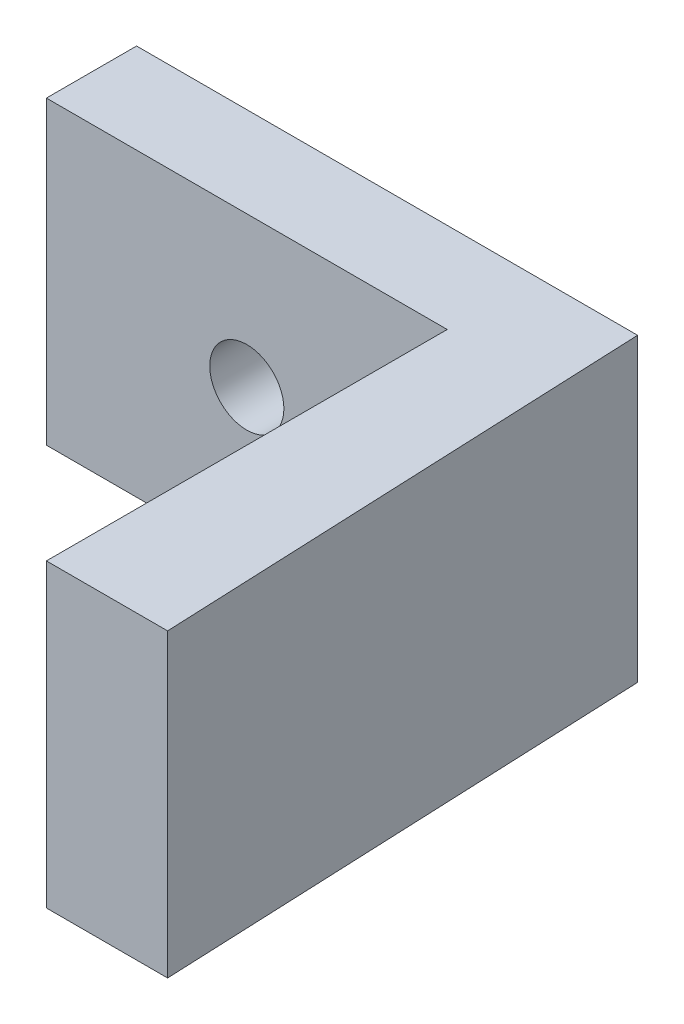
ISO-10303-21;
HEADER;
FILE_DESCRIPTION(('STEP AP214'),'2;1');
FILE_NAME('part.step','',(''),(''),'','','');
FILE_SCHEMA(('AUTOMOTIVE_DESIGN { 1 0 10303 214 1 1 1 1 }'));
ENDSEC;
DATA;
#1=APPLICATION_CONTEXT('core data for automotive mechanical design processes');
#2=APPLICATION_PROTOCOL_DEFINITION('international standard','automotive_design',2000,#1);
#3=PRODUCT_CONTEXT('',#1,'mechanical');
#4=PRODUCT('Part','Part','',(#3));
#5=PRODUCT_RELATED_PRODUCT_CATEGORY('part','',(#4));
#6=PRODUCT_DEFINITION_FORMATION('','',#4);
#7=PRODUCT_DEFINITION_CONTEXT('part definition',#1,'design');
#8=PRODUCT_DEFINITION('design','',#6,#7);
#9=PRODUCT_DEFINITION_SHAPE('','',#8);
#10=(LENGTH_UNIT() NAMED_UNIT(*) SI_UNIT(.MILLI.,.METRE.));
#11=(NAMED_UNIT(*) PLANE_ANGLE_UNIT() SI_UNIT($,.RADIAN.));
#12=(NAMED_UNIT(*) SI_UNIT($,.STERADIAN.) SOLID_ANGLE_UNIT());
#13=UNCERTAINTY_MEASURE_WITH_UNIT(LENGTH_MEASURE(1.E-05),#10,'distance_accuracy_value','');
#14=(GEOMETRIC_REPRESENTATION_CONTEXT(3) GLOBAL_UNCERTAINTY_ASSIGNED_CONTEXT((#13)) GLOBAL_UNIT_ASSIGNED_CONTEXT((#10,
#11,#12)) REPRESENTATION_CONTEXT('',''));
#15=CARTESIAN_POINT('',(0.,0.,0.));
#16=DIRECTION('',(0.,0.,1.));
#17=DIRECTION('',(1.,0.,0.));
#18=AXIS2_PLACEMENT_3D('',#15,#16,#17);
#19=CARTESIAN_POINT('',(0.,15.,0.));
#20=DIRECTION('',(1.,0.,0.));
#21=DIRECTION('',(0.,0.,-1.));
#22=AXIS2_PLACEMENT_3D('',#19,#20,#21);
#23=PLANE('',#22);
#24=DIRECTION('',(0.,0.,1.));
#25=VECTOR('',#24,1.);
#26=CARTESIAN_POINT('',(0.,0.,0.));
#27=LINE('',#26,#25);
#28=CARTESIAN_POINT('',(0.,0.,-4.5));
#29=VERTEX_POINT('',#28);
#30=CARTESIAN_POINT('',(0.,0.,0.));
#31=VERTEX_POINT('',#30);
#32=EDGE_CURVE('E130',#29,#31,#27,.T.);
#33=ORIENTED_EDGE('',*,*,#32,.T.);
#34=DIRECTION('',(0.,-1.,0.));
#35=VECTOR('',#34,1.);
#36=CARTESIAN_POINT('',(0.,15.,0.));
#37=LINE('',#36,#35);
#38=CARTESIAN_POINT('',(0.,15.,0.));
#39=VERTEX_POINT('',#38);
#40=EDGE_CURVE('E11',#39,#31,#37,.T.);
#41=ORIENTED_EDGE('',*,*,#40,.F.);
#42=DIRECTION('',(0.,0.,1.));
#43=VECTOR('',#42,1.);
#44=CARTESIAN_POINT('',(0.,15.,0.));
#45=LINE('',#44,#43);
#46=CARTESIAN_POINT('',(0.,15.,-4.5));
#47=VERTEX_POINT('',#46);
#48=EDGE_CURVE('E146',#47,#39,#45,.T.);
#49=ORIENTED_EDGE('',*,*,#48,.F.);
#50=DIRECTION('',(0.,-1.,0.));
#51=VECTOR('',#50,1.);
#52=CARTESIAN_POINT('',(0.,15.,-4.5));
#53=LINE('',#52,#51);
#54=EDGE_CURVE('E126',#47,#29,#53,.T.);
#55=ORIENTED_EDGE('',*,*,#54,.T.);
#56=EDGE_LOOP('',(#33,#41,#49,#55));
#57=FACE_BOUND('',#56,.T.);
#58=ADVANCED_FACE('F38',(#57),#23,.F.);
#59=CARTESIAN_POINT('',(0.,15.,0.));
#60=DIRECTION('',(0.,0.,-1.));
#61=DIRECTION('',(-1.,0.,0.));
#62=AXIS2_PLACEMENT_3D('',#59,#60,#61);
#63=PLANE('',#62);
#64=CARTESIAN_POINT('',(10.,7.5,0.));
#65=DIRECTION('',(0.,0.,1.));
#66=DIRECTION('',(1.,0.,0.));
#67=AXIS2_PLACEMENT_3D('',#64,#65,#66);
#68=CIRCLE('',#67,1.85);
#69=CARTESIAN_POINT('',(11.85,7.5,0.));
#70=VERTEX_POINT('',#69);
#71=EDGE_CURVE('E167',#70,#70,#68,.T.);
#72=ORIENTED_EDGE('',*,*,#71,.F.);
#73=EDGE_LOOP('',(#72));
#74=FACE_BOUND('',#73,.T.);
#75=DIRECTION('',(1.,0.,0.));
#76=VECTOR('',#75,1.);
#77=CARTESIAN_POINT('',(0.,0.,0.));
#78=LINE('',#77,#76);
#79=CARTESIAN_POINT('',(20.,0.,0.));
#80=VERTEX_POINT('',#79);
#81=EDGE_CURVE('E133',#31,#80,#78,.T.);
#82=ORIENTED_EDGE('',*,*,#81,.T.);
#83=DIRECTION('',(0.,-1.,0.));
#84=VECTOR('',#83,1.);
#85=CARTESIAN_POINT('',(20.,15.,0.));
#86=LINE('',#85,#84);
#87=CARTESIAN_POINT('',(20.,15.,0.));
#88=VERTEX_POINT('',#87);
#89=EDGE_CURVE('E47',#88,#80,#86,.T.);
#90=ORIENTED_EDGE('',*,*,#89,.F.);
#91=DIRECTION('',(1.,0.,0.));
#92=VECTOR('',#91,1.);
#93=CARTESIAN_POINT('',(0.,15.,0.));
#94=LINE('',#93,#92);
#95=EDGE_CURVE('E94',#39,#88,#94,.T.);
#96=ORIENTED_EDGE('',*,*,#95,.F.);
#97=ORIENTED_EDGE('',*,*,#40,.T.);
#98=EDGE_LOOP('',(#82,#90,#96,#97));
#99=FACE_BOUND('',#98,.T.);
#100=ADVANCED_FACE('F187',(#74,#99),#63,.F.);
#101=CARTESIAN_POINT('',(20.,15.,20.));
#102=DIRECTION('',(1.,0.,0.));
#103=DIRECTION('',(0.,0.,-1.));
#104=AXIS2_PLACEMENT_3D('',#101,#102,#103);
#105=PLANE('',#104);
#106=DIRECTION('',(0.,0.,1.));
#107=VECTOR('',#106,1.);
#108=CARTESIAN_POINT('',(20.,0.,20.));
#109=LINE('',#108,#107);
#110=CARTESIAN_POINT('',(20.,0.,20.));
#111=VERTEX_POINT('',#110);
#112=EDGE_CURVE('E137',#80,#111,#109,.T.);
#113=ORIENTED_EDGE('',*,*,#112,.T.);
#114=DIRECTION('',(0.,-1.,0.));
#115=VECTOR('',#114,1.);
#116=CARTESIAN_POINT('',(20.,15.,20.));
#117=LINE('',#116,#115);
#118=CARTESIAN_POINT('',(20.,15.,20.));
#119=VERTEX_POINT('',#118);
#120=EDGE_CURVE('E120',#119,#111,#117,.T.);
#121=ORIENTED_EDGE('',*,*,#120,.F.);
#122=DIRECTION('',(0.,0.,1.));
#123=VECTOR('',#122,1.);
#124=CARTESIAN_POINT('',(20.,15.,20.));
#125=LINE('',#124,#123);
#126=EDGE_CURVE('E109',#88,#119,#125,.T.);
#127=ORIENTED_EDGE('',*,*,#126,.F.);
#128=ORIENTED_EDGE('',*,*,#89,.T.);
#129=EDGE_LOOP('',(#113,#121,#127,#128));
#130=FACE_BOUND('',#129,.T.);
#131=ADVANCED_FACE('F156',(#130),#105,.F.);
#132=CARTESIAN_POINT('',(26.0482728718616,15.,20.));
#133=DIRECTION('',(0.,0.,-1.));
#134=DIRECTION('',(-1.,0.,0.));
#135=AXIS2_PLACEMENT_3D('',#132,#133,#134);
#136=PLANE('',#135);
#137=DIRECTION('',(1.,0.,0.));
#138=VECTOR('',#137,1.);
#139=CARTESIAN_POINT('',(26.0482728718616,0.,20.));
#140=LINE('',#139,#138);
#141=CARTESIAN_POINT('',(26.0482728718616,0.,20.));
#142=VERTEX_POINT('',#141);
#143=EDGE_CURVE('E118',#111,#142,#140,.T.);
#144=ORIENTED_EDGE('',*,*,#143,.T.);
#145=DIRECTION('',(0.,-1.,0.));
#146=VECTOR('',#145,1.);
#147=CARTESIAN_POINT('',(26.0482728718616,15.,20.));
#148=LINE('',#147,#146);
#149=CARTESIAN_POINT('',(26.0482728718616,15.,20.));
#150=VERTEX_POINT('',#149);
#151=EDGE_CURVE('E115',#150,#142,#148,.T.);
#152=ORIENTED_EDGE('',*,*,#151,.F.);
#153=DIRECTION('',(1.,0.,0.));
#154=VECTOR('',#153,1.);
#155=CARTESIAN_POINT('',(26.0482728718616,15.,20.));
#156=LINE('',#155,#154);
#157=EDGE_CURVE('E102',#119,#150,#156,.T.);
#158=ORIENTED_EDGE('',*,*,#157,.F.);
#159=ORIENTED_EDGE('',*,*,#120,.T.);
#160=EDGE_LOOP('',(#144,#152,#158,#159));
#161=FACE_BOUND('',#160,.T.);
#162=ADVANCED_FACE('F116',(#161),#136,.F.);
#163=CARTESIAN_POINT('',(25.,15.,-4.5));
#164=DIRECTION('',(-0.999085906264048,0.,0.0427475368243189));
#165=DIRECTION('',(0.0427475368243189,0.,0.999085906264048));
#166=AXIS2_PLACEMENT_3D('',#163,#164,#165);
#167=PLANE('',#166);
#168=DIRECTION('',(-0.0427475368243189,0.,-0.999085906264048));
#169=VECTOR('',#168,1.);
#170=CARTESIAN_POINT('',(25.,0.,-4.5));
#171=LINE('',#170,#169);
#172=CARTESIAN_POINT('',(25.,0.,-4.5));
#173=VERTEX_POINT('',#172);
#174=EDGE_CURVE('E141',#142,#173,#171,.T.);
#175=ORIENTED_EDGE('',*,*,#174,.T.);
#176=DIRECTION('',(0.,-1.,0.));
#177=VECTOR('',#176,1.);
#178=CARTESIAN_POINT('',(25.,15.,-4.5));
#179=LINE('',#178,#177);
#180=CARTESIAN_POINT('',(25.,15.,-4.5));
#181=VERTEX_POINT('',#180);
#182=EDGE_CURVE('E121',#181,#173,#179,.T.);
#183=ORIENTED_EDGE('',*,*,#182,.F.);
#184=DIRECTION('',(-0.0427475368243189,0.,-0.999085906264048));
#185=VECTOR('',#184,1.);
#186=CARTESIAN_POINT('',(25.,15.,-4.5));
#187=LINE('',#186,#185);
#188=EDGE_CURVE('E106',#150,#181,#187,.T.);
#189=ORIENTED_EDGE('',*,*,#188,.F.);
#190=ORIENTED_EDGE('',*,*,#151,.T.);
#191=EDGE_LOOP('',(#175,#183,#189,#190));
#192=FACE_BOUND('',#191,.T.);
#193=ADVANCED_FACE('F123',(#192),#167,.F.);
#194=CARTESIAN_POINT('',(0.,15.,-4.5));
#195=DIRECTION('',(0.,0.,1.));
#196=DIRECTION('',(1.,0.,0.));
#197=AXIS2_PLACEMENT_3D('',#194,#195,#196);
#198=PLANE('',#197);
#199=CARTESIAN_POINT('',(10.,7.5,-4.5));
#200=DIRECTION('',(0.,0.,1.));
#201=DIRECTION('',(1.,0.,0.));
#202=AXIS2_PLACEMENT_3D('',#199,#200,#201);
#203=CIRCLE('',#202,1.85);
#204=CARTESIAN_POINT('',(11.85,7.5,-4.5));
#205=VERTEX_POINT('',#204);
#206=EDGE_CURVE('E134',#205,#205,#203,.T.);
#207=ORIENTED_EDGE('',*,*,#206,.T.);
#208=EDGE_LOOP('',(#207));
#209=FACE_BOUND('',#208,.T.);
#210=DIRECTION('',(-1.,0.,0.));
#211=VECTOR('',#210,1.);
#212=CARTESIAN_POINT('',(0.,0.,-4.5));
#213=LINE('',#212,#211);
#214=EDGE_CURVE('E82',#173,#29,#213,.T.);
#215=ORIENTED_EDGE('',*,*,#214,.T.);
#216=ORIENTED_EDGE('',*,*,#54,.F.);
#217=DIRECTION('',(-1.,0.,0.));
#218=VECTOR('',#217,1.);
#219=CARTESIAN_POINT('',(20.,15.,-4.5));
#220=LINE('',#219,#218);
#221=EDGE_CURVE('E57',#181,#47,#220,.T.);
#222=ORIENTED_EDGE('',*,*,#221,.F.);
#223=ORIENTED_EDGE('',*,*,#182,.T.);
#224=EDGE_LOOP('',(#215,#216,#222,#223));
#225=FACE_BOUND('',#224,.T.);
#226=ADVANCED_FACE('F158',(#209,#225),#198,.F.);
#227=CARTESIAN_POINT('',(0.,15.,0.));
#228=DIRECTION('',(0.,-1.,0.));
#229=DIRECTION('',(0.,0.,-1.));
#230=AXIS2_PLACEMENT_3D('',#227,#228,#229);
#231=PLANE('',#230);
#232=ORIENTED_EDGE('',*,*,#48,.T.);
#233=ORIENTED_EDGE('',*,*,#95,.T.);
#234=ORIENTED_EDGE('',*,*,#126,.T.);
#235=ORIENTED_EDGE('',*,*,#157,.T.);
#236=ORIENTED_EDGE('',*,*,#188,.T.);
#237=ORIENTED_EDGE('',*,*,#221,.T.);
#238=EDGE_LOOP('',(#232,#233,#234,#235,#236,#237));
#239=FACE_BOUND('',#238,.T.);
#240=ADVANCED_FACE('F104',(#239),#231,.F.);
#241=CARTESIAN_POINT('',(0.,0.,0.));
#242=DIRECTION('',(0.,-1.,0.));
#243=DIRECTION('',(0.,0.,-1.));
#244=AXIS2_PLACEMENT_3D('',#241,#242,#243);
#245=PLANE('',#244);
#246=ORIENTED_EDGE('',*,*,#32,.F.);
#247=ORIENTED_EDGE('',*,*,#214,.F.);
#248=ORIENTED_EDGE('',*,*,#174,.F.);
#249=ORIENTED_EDGE('',*,*,#143,.F.);
#250=ORIENTED_EDGE('',*,*,#112,.F.);
#251=ORIENTED_EDGE('',*,*,#81,.F.);
#252=EDGE_LOOP('',(#246,#247,#248,#249,#250,#251));
#253=FACE_BOUND('',#252,.T.);
#254=ADVANCED_FACE('F157',(#253),#245,.T.);
#255=CARTESIAN_POINT('',(10.,7.5,-4.5));
#256=DIRECTION('',(0.,0.,1.));
#257=DIRECTION('',(1.,0.,0.));
#258=AXIS2_PLACEMENT_3D('',#255,#256,#257);
#259=CYLINDRICAL_SURFACE('',#258,1.85);
#260=ORIENTED_EDGE('',*,*,#206,.F.);
#261=EDGE_LOOP('',(#260));
#262=FACE_BOUND('',#261,.T.);
#263=ORIENTED_EDGE('',*,*,#71,.T.);
#264=EDGE_LOOP('',(#263));
#265=FACE_BOUND('',#264,.T.);
#266=ADVANCED_FACE('F178',(#262,#265),#259,.F.);
#267=CLOSED_SHELL('',(#58,#100,#131,#162,#193,#226,#240,#254,#266));
#268=MANIFOLD_SOLID_BREP('B2',#267);
#269=ADVANCED_BREP_SHAPE_REPRESENTATION('',(#18,#268),#14);
#270=SHAPE_DEFINITION_REPRESENTATION(#9,#269);
ENDSEC;
END-ISO-10303-21;
